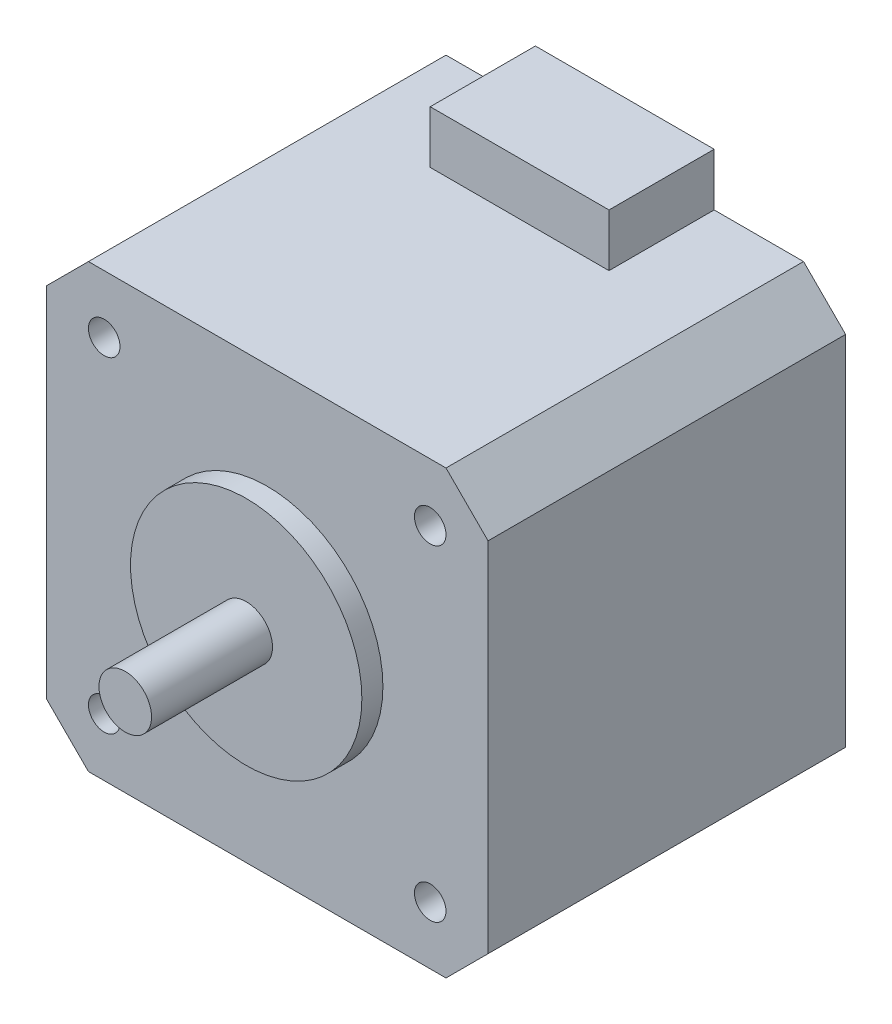
ISO-10303-21;
HEADER;
FILE_DESCRIPTION(('STEP AP214'),'2;1');
FILE_NAME('part.step','',(''),(''),'','','');
FILE_SCHEMA(('AUTOMOTIVE_DESIGN { 1 0 10303 214 1 1 1 1 }'));
ENDSEC;
DATA;
#1=APPLICATION_CONTEXT('core data for automotive mechanical design processes');
#2=APPLICATION_PROTOCOL_DEFINITION('international standard','automotive_design',2000,#1);
#3=PRODUCT_CONTEXT('',#1,'mechanical');
#4=PRODUCT('Part','Part','',(#3));
#5=PRODUCT_RELATED_PRODUCT_CATEGORY('part','',(#4));
#6=PRODUCT_DEFINITION_FORMATION('','',#4);
#7=PRODUCT_DEFINITION_CONTEXT('part definition',#1,'design');
#8=PRODUCT_DEFINITION('design','',#6,#7);
#9=PRODUCT_DEFINITION_SHAPE('','',#8);
#10=(LENGTH_UNIT() NAMED_UNIT(*) SI_UNIT(.MILLI.,.METRE.));
#11=(NAMED_UNIT(*) PLANE_ANGLE_UNIT() SI_UNIT($,.RADIAN.));
#12=(NAMED_UNIT(*) SI_UNIT($,.STERADIAN.) SOLID_ANGLE_UNIT());
#13=UNCERTAINTY_MEASURE_WITH_UNIT(LENGTH_MEASURE(1.E-05),#10,'distance_accuracy_value','');
#14=(GEOMETRIC_REPRESENTATION_CONTEXT(3) GLOBAL_UNCERTAINTY_ASSIGNED_CONTEXT((#13)) GLOBAL_UNIT_ASSIGNED_CONTEXT((#10,
#11,#12)) REPRESENTATION_CONTEXT('',''));
#15=CARTESIAN_POINT('',(0.,0.,0.));
#16=DIRECTION('',(0.,0.,1.));
#17=DIRECTION('',(1.,0.,0.));
#18=AXIS2_PLACEMENT_3D('',#15,#16,#17);
#19=CARTESIAN_POINT('',(0.,42.,34.));
#20=DIRECTION('',(0.,-1.,0.));
#21=DIRECTION('',(0.,0.,-1.));
#22=AXIS2_PLACEMENT_3D('',#19,#20,#21);
#23=PLANE('',#22);
#24=DIRECTION('',(0.,0.,1.));
#25=VECTOR('',#24,1.);
#26=CARTESIAN_POINT('',(12.5,42.,0.));
#27=LINE('',#26,#25);
#28=CARTESIAN_POINT('',(12.5,42.,0.));
#29=VERTEX_POINT('',#28);
#30=CARTESIAN_POINT('',(12.5,42.,10.));
#31=VERTEX_POINT('',#30);
#32=EDGE_CURVE('E69',#29,#31,#27,.T.);
#33=ORIENTED_EDGE('',*,*,#32,.F.);
#34=DIRECTION('',(-1.,0.,0.));
#35=VECTOR('',#34,1.);
#36=CARTESIAN_POINT('',(0.,42.,0.));
#37=LINE('',#36,#35);
#38=CARTESIAN_POINT('',(4.00000000000002,42.,0.));
#39=VERTEX_POINT('',#38);
#40=EDGE_CURVE('E212',#29,#39,#37,.T.);
#41=ORIENTED_EDGE('',*,*,#40,.T.);
#42=DIRECTION('',(0.,0.,1.));
#43=VECTOR('',#42,1.);
#44=CARTESIAN_POINT('',(4.00000000000002,42.,34.));
#45=LINE('',#44,#43);
#46=CARTESIAN_POINT('',(4.00000000000002,42.,34.));
#47=VERTEX_POINT('',#46);
#48=EDGE_CURVE('E175',#39,#47,#45,.T.);
#49=ORIENTED_EDGE('',*,*,#48,.T.);
#50=DIRECTION('',(-1.,0.,0.));
#51=VECTOR('',#50,1.);
#52=CARTESIAN_POINT('',(0.,42.,34.));
#53=LINE('',#52,#51);
#54=CARTESIAN_POINT('',(38.,42.,34.));
#55=VERTEX_POINT('',#54);
#56=EDGE_CURVE('E184',#55,#47,#53,.T.);
#57=ORIENTED_EDGE('',*,*,#56,.F.);
#58=DIRECTION('',(0.,0.,-1.));
#59=VECTOR('',#58,1.);
#60=CARTESIAN_POINT('',(38.,42.,34.));
#61=LINE('',#60,#59);
#62=CARTESIAN_POINT('',(38.,42.,0.));
#63=VERTEX_POINT('',#62);
#64=EDGE_CURVE('E217',#55,#63,#61,.T.);
#65=ORIENTED_EDGE('',*,*,#64,.T.);
#66=CARTESIAN_POINT('',(29.5,42.,0.));
#67=VERTEX_POINT('',#66);
#68=EDGE_CURVE('E190',#63,#67,#37,.T.);
#69=ORIENTED_EDGE('',*,*,#68,.T.);
#70=DIRECTION('',(0.,0.,-1.));
#71=VECTOR('',#70,1.);
#72=CARTESIAN_POINT('',(29.5,42.,0.));
#73=LINE('',#72,#71);
#74=CARTESIAN_POINT('',(29.5,42.,10.));
#75=VERTEX_POINT('',#74);
#76=EDGE_CURVE('E156',#75,#67,#73,.T.);
#77=ORIENTED_EDGE('',*,*,#76,.F.);
#78=DIRECTION('',(1.,0.,0.));
#79=VECTOR('',#78,1.);
#80=CARTESIAN_POINT('',(12.5,42.,10.));
#81=LINE('',#80,#79);
#82=EDGE_CURVE('E64',#31,#75,#81,.T.);
#83=ORIENTED_EDGE('',*,*,#82,.F.);
#84=EDGE_LOOP('',(#33,#41,#49,#57,#65,#69,#77,#83));
#85=FACE_BOUND('',#84,.T.);
#86=ADVANCED_FACE('F47',(#85),#23,.F.);
#87=CARTESIAN_POINT('',(0.,0.,34.));
#88=DIRECTION('',(1.,0.,0.));
#89=DIRECTION('',(0.,0.,-1.));
#90=AXIS2_PLACEMENT_3D('',#87,#88,#89);
#91=PLANE('',#90);
#92=DIRECTION('',(0.,-1.,0.));
#93=VECTOR('',#92,1.);
#94=CARTESIAN_POINT('',(0.,0.,0.));
#95=LINE('',#94,#93);
#96=CARTESIAN_POINT('',(0.,38.,0.));
#97=VERTEX_POINT('',#96);
#98=CARTESIAN_POINT('',(0.,4.00000000000002,0.));
#99=VERTEX_POINT('',#98);
#100=EDGE_CURVE('E180',#97,#99,#95,.T.);
#101=ORIENTED_EDGE('',*,*,#100,.T.);
#102=DIRECTION('',(0.,0.,1.));
#103=VECTOR('',#102,1.);
#104=CARTESIAN_POINT('',(0.,4.00000000000002,34.));
#105=LINE('',#104,#103);
#106=CARTESIAN_POINT('',(0.,4.00000000000002,34.));
#107=VERTEX_POINT('',#106);
#108=EDGE_CURVE('E11',#99,#107,#105,.T.);
#109=ORIENTED_EDGE('',*,*,#108,.T.);
#110=DIRECTION('',(0.,-1.,0.));
#111=VECTOR('',#110,1.);
#112=CARTESIAN_POINT('',(0.,0.,34.));
#113=LINE('',#112,#111);
#114=CARTESIAN_POINT('',(0.,38.,34.));
#115=VERTEX_POINT('',#114);
#116=EDGE_CURVE('E185',#115,#107,#113,.T.);
#117=ORIENTED_EDGE('',*,*,#116,.F.);
#118=DIRECTION('',(0.,0.,-1.));
#119=VECTOR('',#118,1.);
#120=CARTESIAN_POINT('',(0.,38.,34.));
#121=LINE('',#120,#119);
#122=EDGE_CURVE('E57',#115,#97,#121,.T.);
#123=ORIENTED_EDGE('',*,*,#122,.T.);
#124=EDGE_LOOP('',(#101,#109,#117,#123));
#125=FACE_BOUND('',#124,.T.);
#126=ADVANCED_FACE('F265',(#125),#91,.F.);
#127=CARTESIAN_POINT('',(0.,0.,34.));
#128=DIRECTION('',(0.,1.,0.));
#129=DIRECTION('',(0.,0.,1.));
#130=AXIS2_PLACEMENT_3D('',#127,#128,#129);
#131=PLANE('',#130);
#132=DIRECTION('',(1.,0.,0.));
#133=VECTOR('',#132,1.);
#134=CARTESIAN_POINT('',(0.,0.,0.));
#135=LINE('',#134,#133);
#136=CARTESIAN_POINT('',(4.,0.,0.));
#137=VERTEX_POINT('',#136);
#138=CARTESIAN_POINT('',(38.,0.,0.));
#139=VERTEX_POINT('',#138);
#140=EDGE_CURVE('E204',#137,#139,#135,.T.);
#141=ORIENTED_EDGE('',*,*,#140,.T.);
#142=DIRECTION('',(0.,0.,1.));
#143=VECTOR('',#142,1.);
#144=CARTESIAN_POINT('',(38.,0.,34.));
#145=LINE('',#144,#143);
#146=CARTESIAN_POINT('',(38.,0.,34.));
#147=VERTEX_POINT('',#146);
#148=EDGE_CURVE('E257',#139,#147,#145,.T.);
#149=ORIENTED_EDGE('',*,*,#148,.T.);
#150=DIRECTION('',(1.,0.,0.));
#151=VECTOR('',#150,1.);
#152=CARTESIAN_POINT('',(0.,0.,34.));
#153=LINE('',#152,#151);
#154=CARTESIAN_POINT('',(4.,0.,34.));
#155=VERTEX_POINT('',#154);
#156=EDGE_CURVE('E189',#155,#147,#153,.T.);
#157=ORIENTED_EDGE('',*,*,#156,.F.);
#158=DIRECTION('',(0.,0.,-1.));
#159=VECTOR('',#158,1.);
#160=CARTESIAN_POINT('',(4.,0.,34.));
#161=LINE('',#160,#159);
#162=EDGE_CURVE('E253',#155,#137,#161,.T.);
#163=ORIENTED_EDGE('',*,*,#162,.T.);
#164=EDGE_LOOP('',(#141,#149,#157,#163));
#165=FACE_BOUND('',#164,.T.);
#166=ADVANCED_FACE('F280',(#165),#131,.F.);
#167=CARTESIAN_POINT('',(42.,0.,34.));
#168=DIRECTION('',(-1.,0.,0.));
#169=DIRECTION('',(0.,-1.,0.));
#170=AXIS2_PLACEMENT_3D('',#167,#168,#169);
#171=PLANE('',#170);
#172=DIRECTION('',(0.,1.,0.));
#173=VECTOR('',#172,1.);
#174=CARTESIAN_POINT('',(42.,0.,0.));
#175=LINE('',#174,#173);
#176=CARTESIAN_POINT('',(42.,4.,0.));
#177=VERTEX_POINT('',#176);
#178=CARTESIAN_POINT('',(42.,38.,0.));
#179=VERTEX_POINT('',#178);
#180=EDGE_CURVE('E208',#177,#179,#175,.T.);
#181=ORIENTED_EDGE('',*,*,#180,.T.);
#182=DIRECTION('',(0.,0.,1.));
#183=VECTOR('',#182,1.);
#184=CARTESIAN_POINT('',(42.,38.,34.));
#185=LINE('',#184,#183);
#186=CARTESIAN_POINT('',(42.,38.,34.));
#187=VERTEX_POINT('',#186);
#188=EDGE_CURVE('E238',#179,#187,#185,.T.);
#189=ORIENTED_EDGE('',*,*,#188,.T.);
#190=DIRECTION('',(0.,1.,0.));
#191=VECTOR('',#190,1.);
#192=CARTESIAN_POINT('',(42.,0.,34.));
#193=LINE('',#192,#191);
#194=CARTESIAN_POINT('',(42.,4.,34.));
#195=VERTEX_POINT('',#194);
#196=EDGE_CURVE('E194',#195,#187,#193,.T.);
#197=ORIENTED_EDGE('',*,*,#196,.F.);
#198=DIRECTION('',(0.,0.,-1.));
#199=VECTOR('',#198,1.);
#200=CARTESIAN_POINT('',(42.,4.,34.));
#201=LINE('',#200,#199);
#202=EDGE_CURVE('E234',#195,#177,#201,.T.);
#203=ORIENTED_EDGE('',*,*,#202,.T.);
#204=EDGE_LOOP('',(#181,#189,#197,#203));
#205=FACE_BOUND('',#204,.T.);
#206=ADVANCED_FACE('F291',(#205),#171,.F.);
#207=CARTESIAN_POINT('',(0.,0.,34.));
#208=DIRECTION('',(0.,0.,-1.));
#209=DIRECTION('',(-1.,0.,0.));
#210=AXIS2_PLACEMENT_3D('',#207,#208,#209);
#211=PLANE('',#210);
#212=CARTESIAN_POINT('',(5.5,5.50000000000001,34.));
#213=DIRECTION('',(0.,0.,1.));
#214=DIRECTION('',(1.,0.,0.));
#215=AXIS2_PLACEMENT_3D('',#212,#213,#214);
#216=CIRCLE('',#215,1.5);
#217=CARTESIAN_POINT('',(7.,5.50000000000001,34.));
#218=VERTEX_POINT('',#217);
#219=EDGE_CURVE('E500',#218,#218,#216,.T.);
#220=ORIENTED_EDGE('',*,*,#219,.F.);
#221=EDGE_LOOP('',(#220));
#222=FACE_BOUND('',#221,.T.);
#223=CARTESIAN_POINT('',(36.5,5.50000000000001,34.));
#224=DIRECTION('',(0.,0.,1.));
#225=DIRECTION('',(1.,0.,0.));
#226=AXIS2_PLACEMENT_3D('',#223,#224,#225);
#227=CIRCLE('',#226,1.5);
#228=CARTESIAN_POINT('',(38.,5.50000000000001,34.));
#229=VERTEX_POINT('',#228);
#230=EDGE_CURVE('E504',#229,#229,#227,.T.);
#231=ORIENTED_EDGE('',*,*,#230,.F.);
#232=EDGE_LOOP('',(#231));
#233=FACE_BOUND('',#232,.T.);
#234=CARTESIAN_POINT('',(36.5,36.5,34.));
#235=DIRECTION('',(0.,0.,1.));
#236=DIRECTION('',(1.,0.,0.));
#237=AXIS2_PLACEMENT_3D('',#234,#235,#236);
#238=CIRCLE('',#237,1.5);
#239=CARTESIAN_POINT('',(38.,36.5,34.));
#240=VERTEX_POINT('',#239);
#241=EDGE_CURVE('E508',#240,#240,#238,.T.);
#242=ORIENTED_EDGE('',*,*,#241,.F.);
#243=EDGE_LOOP('',(#242));
#244=FACE_BOUND('',#243,.T.);
#245=CARTESIAN_POINT('',(5.5,36.5,34.));
#246=DIRECTION('',(0.,0.,1.));
#247=DIRECTION('',(1.,0.,0.));
#248=AXIS2_PLACEMENT_3D('',#245,#246,#247);
#249=CIRCLE('',#248,1.5);
#250=CARTESIAN_POINT('',(7.,36.5,34.));
#251=VERTEX_POINT('',#250);
#252=EDGE_CURVE('E512',#251,#251,#249,.T.);
#253=ORIENTED_EDGE('',*,*,#252,.F.);
#254=EDGE_LOOP('',(#253));
#255=FACE_BOUND('',#254,.T.);
#256=CARTESIAN_POINT('',(21.,21.,34.));
#257=DIRECTION('',(0.,0.,1.));
#258=DIRECTION('',(1.,0.,0.));
#259=AXIS2_PLACEMENT_3D('',#256,#257,#258);
#260=CIRCLE('',#259,11.);
#261=CARTESIAN_POINT('',(32.,21.,34.));
#262=VERTEX_POINT('',#261);
#263=EDGE_CURVE('E176',#262,#262,#260,.T.);
#264=ORIENTED_EDGE('',*,*,#263,.F.);
#265=EDGE_LOOP('',(#264));
#266=FACE_BOUND('',#265,.T.);
#267=ORIENTED_EDGE('',*,*,#196,.T.);
#268=DIRECTION('',(0.707106781186546,-0.707106781186549,0.));
#269=VECTOR('',#268,1.);
#270=CARTESIAN_POINT('',(38.,42.,34.));
#271=LINE('',#270,#269);
#272=EDGE_CURVE('E250',#187,#55,#271,.F.);
#273=ORIENTED_EDGE('',*,*,#272,.T.);
#274=ORIENTED_EDGE('',*,*,#56,.T.);
#275=DIRECTION('',(0.707106781186549,0.707106781186546,0.));
#276=VECTOR('',#275,1.);
#277=CARTESIAN_POINT('',(0.,38.,34.));
#278=LINE('',#277,#276);
#279=EDGE_CURVE('E241',#47,#115,#278,.F.);
#280=ORIENTED_EDGE('',*,*,#279,.T.);
#281=ORIENTED_EDGE('',*,*,#116,.T.);
#282=DIRECTION('',(-0.707106781186546,0.707106781186549,0.));
#283=VECTOR('',#282,1.);
#284=CARTESIAN_POINT('',(4.,0.,34.));
#285=LINE('',#284,#283);
#286=EDGE_CURVE('E244',#107,#155,#285,.F.);
#287=ORIENTED_EDGE('',*,*,#286,.T.);
#288=ORIENTED_EDGE('',*,*,#156,.T.);
#289=DIRECTION('',(-0.707106781186549,-0.707106781186546,0.));
#290=VECTOR('',#289,1.);
#291=CARTESIAN_POINT('',(42.,4.,34.));
#292=LINE('',#291,#290);
#293=EDGE_CURVE('E247',#147,#195,#292,.F.);
#294=ORIENTED_EDGE('',*,*,#293,.T.);
#295=EDGE_LOOP('',(#267,#273,#274,#280,#281,#287,#288,#294));
#296=FACE_BOUND('',#295,.T.);
#297=ADVANCED_FACE('F284',(#222,#233,#244,#255,#266,#296),#211,.F.);
#298=CARTESIAN_POINT('',(0.,0.,0.));
#299=DIRECTION('',(0.,0.,-1.));
#300=DIRECTION('',(-1.,0.,0.));
#301=AXIS2_PLACEMENT_3D('',#298,#299,#300);
#302=PLANE('',#301);
#303=ORIENTED_EDGE('',*,*,#68,.F.);
#304=DIRECTION('',(-0.707106781186546,0.707106781186549,0.));
#305=VECTOR('',#304,1.);
#306=CARTESIAN_POINT('',(40.0000000000001,39.9999999999999,0.));
#307=LINE('',#306,#305);
#308=EDGE_CURVE('E231',#63,#179,#307,.F.);
#309=ORIENTED_EDGE('',*,*,#308,.T.);
#310=ORIENTED_EDGE('',*,*,#180,.F.);
#311=DIRECTION('',(0.707106781186549,0.707106781186546,0.));
#312=VECTOR('',#311,1.);
#313=CARTESIAN_POINT('',(18.9999999999999,-19.,0.));
#314=LINE('',#313,#312);
#315=EDGE_CURVE('E228',#177,#139,#314,.F.);
#316=ORIENTED_EDGE('',*,*,#315,.T.);
#317=ORIENTED_EDGE('',*,*,#140,.F.);
#318=DIRECTION('',(0.707106781186546,-0.707106781186549,0.));
#319=VECTOR('',#318,1.);
#320=CARTESIAN_POINT('',(2.00000000000001,2.,0.));
#321=LINE('',#320,#319);
#322=EDGE_CURVE('E225',#137,#99,#321,.F.);
#323=ORIENTED_EDGE('',*,*,#322,.T.);
#324=ORIENTED_EDGE('',*,*,#100,.F.);
#325=DIRECTION('',(-0.707106781186549,-0.707106781186546,0.));
#326=VECTOR('',#325,1.);
#327=CARTESIAN_POINT('',(-19.,19.0000000000001,0.));
#328=LINE('',#327,#326);
#329=EDGE_CURVE('E221',#97,#39,#328,.F.);
#330=ORIENTED_EDGE('',*,*,#329,.T.);
#331=ORIENTED_EDGE('',*,*,#40,.F.);
#332=DIRECTION('',(0.,-1.,0.));
#333=VECTOR('',#332,1.);
#334=CARTESIAN_POINT('',(12.5,47.,0.));
#335=LINE('',#334,#333);
#336=CARTESIAN_POINT('',(12.5,47.,0.));
#337=VERTEX_POINT('',#336);
#338=EDGE_CURVE('E531',#337,#29,#335,.T.);
#339=ORIENTED_EDGE('',*,*,#338,.F.);
#340=DIRECTION('',(-1.,0.,0.));
#341=VECTOR('',#340,1.);
#342=CARTESIAN_POINT('',(12.5,47.,0.));
#343=LINE('',#342,#341);
#344=CARTESIAN_POINT('',(29.5,47.,0.));
#345=VERTEX_POINT('',#344);
#346=EDGE_CURVE('E151',#345,#337,#343,.T.);
#347=ORIENTED_EDGE('',*,*,#346,.F.);
#348=DIRECTION('',(0.,-1.,0.));
#349=VECTOR('',#348,1.);
#350=CARTESIAN_POINT('',(29.5,47.,0.));
#351=LINE('',#350,#349);
#352=EDGE_CURVE('E167',#345,#67,#351,.T.);
#353=ORIENTED_EDGE('',*,*,#352,.T.);
#354=EDGE_LOOP('',(#303,#309,#310,#316,#317,#323,#324,#330,#331,#339,#347,#353));
#355=FACE_BOUND('',#354,.T.);
#356=ADVANCED_FACE('F271',(#355),#302,.T.);
#357=CARTESIAN_POINT('',(21.,21.,36.));
#358=DIRECTION('',(0.,0.,-1.));
#359=DIRECTION('',(-1.,0.,0.));
#360=AXIS2_PLACEMENT_3D('',#357,#358,#359);
#361=CYLINDRICAL_SURFACE('',#360,11.);
#362=CARTESIAN_POINT('',(21.,21.,36.));
#363=DIRECTION('',(0.,0.,1.));
#364=DIRECTION('',(1.,0.,0.));
#365=AXIS2_PLACEMENT_3D('',#362,#363,#364);
#366=CIRCLE('',#365,11.);
#367=CARTESIAN_POINT('',(32.,21.,36.));
#368=VERTEX_POINT('',#367);
#369=EDGE_CURVE('E165',#368,#368,#366,.T.);
#370=ORIENTED_EDGE('',*,*,#369,.F.);
#371=EDGE_LOOP('',(#370));
#372=FACE_BOUND('',#371,.T.);
#373=ORIENTED_EDGE('',*,*,#263,.T.);
#374=EDGE_LOOP('',(#373));
#375=FACE_BOUND('',#374,.T.);
#376=ADVANCED_FACE('F362',(#372,#375),#361,.T.);
#377=CARTESIAN_POINT('',(21.,21.,36.));
#378=DIRECTION('',(0.,0.,1.));
#379=DIRECTION('',(1.,0.,0.));
#380=AXIS2_PLACEMENT_3D('',#377,#378,#379);
#381=PLANE('',#380);
#382=CARTESIAN_POINT('',(21.,21.,36.));
#383=DIRECTION('',(0.,0.,1.));
#384=DIRECTION('',(1.,0.,0.));
#385=AXIS2_PLACEMENT_3D('',#382,#383,#384);
#386=CIRCLE('',#385,2.5);
#387=CARTESIAN_POINT('',(23.5,21.,36.));
#388=VERTEX_POINT('',#387);
#389=EDGE_CURVE('E171',#388,#388,#386,.T.);
#390=ORIENTED_EDGE('',*,*,#389,.F.);
#391=EDGE_LOOP('',(#390));
#392=FACE_BOUND('',#391,.T.);
#393=ORIENTED_EDGE('',*,*,#369,.T.);
#394=EDGE_LOOP('',(#393));
#395=FACE_BOUND('',#394,.T.);
#396=ADVANCED_FACE('F488',(#392,#395),#381,.T.);
#397=CARTESIAN_POINT('',(21.,21.,47.5));
#398=DIRECTION('',(0.,0.,-1.));
#399=DIRECTION('',(-1.,0.,0.));
#400=AXIS2_PLACEMENT_3D('',#397,#398,#399);
#401=CYLINDRICAL_SURFACE('',#400,2.5);
#402=CARTESIAN_POINT('',(21.,21.,47.5));
#403=DIRECTION('',(0.,0.,1.));
#404=DIRECTION('',(1.,0.,0.));
#405=AXIS2_PLACEMENT_3D('',#402,#403,#404);
#406=CIRCLE('',#405,2.5);
#407=CARTESIAN_POINT('',(23.5,21.,47.5));
#408=VERTEX_POINT('',#407);
#409=EDGE_CURVE('E160',#408,#408,#406,.T.);
#410=ORIENTED_EDGE('',*,*,#409,.F.);
#411=EDGE_LOOP('',(#410));
#412=FACE_BOUND('',#411,.T.);
#413=ORIENTED_EDGE('',*,*,#389,.T.);
#414=EDGE_LOOP('',(#413));
#415=FACE_BOUND('',#414,.T.);
#416=ADVANCED_FACE('F484',(#412,#415),#401,.T.);
#417=CARTESIAN_POINT('',(21.,21.,47.5));
#418=DIRECTION('',(0.,0.,1.));
#419=DIRECTION('',(1.,0.,0.));
#420=AXIS2_PLACEMENT_3D('',#417,#418,#419);
#421=PLANE('',#420);
#422=ORIENTED_EDGE('',*,*,#409,.T.);
#423=EDGE_LOOP('',(#422));
#424=FACE_BOUND('',#423,.T.);
#425=ADVANCED_FACE('F326',(#424),#421,.T.);
#426=CARTESIAN_POINT('',(38.,42.,34.));
#427=DIRECTION('',(-0.707106781186549,-0.707106781186546,0.));
#428=DIRECTION('',(0.,0.,-1.));
#429=AXIS2_PLACEMENT_3D('',#426,#427,#428);
#430=PLANE('',#429);
#431=ORIENTED_EDGE('',*,*,#272,.F.);
#432=ORIENTED_EDGE('',*,*,#188,.F.);
#433=ORIENTED_EDGE('',*,*,#308,.F.);
#434=ORIENTED_EDGE('',*,*,#64,.F.);
#435=EDGE_LOOP('',(#431,#432,#433,#434));
#436=FACE_BOUND('',#435,.T.);
#437=ADVANCED_FACE('F297',(#436),#430,.F.);
#438=CARTESIAN_POINT('',(42.,4.,34.));
#439=DIRECTION('',(-0.707106781186546,0.707106781186549,0.));
#440=DIRECTION('',(0.,0.,-1.));
#441=AXIS2_PLACEMENT_3D('',#438,#439,#440);
#442=PLANE('',#441);
#443=ORIENTED_EDGE('',*,*,#293,.F.);
#444=ORIENTED_EDGE('',*,*,#148,.F.);
#445=ORIENTED_EDGE('',*,*,#315,.F.);
#446=ORIENTED_EDGE('',*,*,#202,.F.);
#447=EDGE_LOOP('',(#443,#444,#445,#446));
#448=FACE_BOUND('',#447,.T.);
#449=ADVANCED_FACE('F288',(#448),#442,.F.);
#450=CARTESIAN_POINT('',(4.,0.,34.));
#451=DIRECTION('',(0.707106781186549,0.707106781186546,0.));
#452=DIRECTION('',(0.,0.,-1.));
#453=AXIS2_PLACEMENT_3D('',#450,#451,#452);
#454=PLANE('',#453);
#455=ORIENTED_EDGE('',*,*,#286,.F.);
#456=ORIENTED_EDGE('',*,*,#108,.F.);
#457=ORIENTED_EDGE('',*,*,#322,.F.);
#458=ORIENTED_EDGE('',*,*,#162,.F.);
#459=EDGE_LOOP('',(#455,#456,#457,#458));
#460=FACE_BOUND('',#459,.T.);
#461=ADVANCED_FACE('F277',(#460),#454,.F.);
#462=CARTESIAN_POINT('',(0.,38.,34.));
#463=DIRECTION('',(0.707106781186546,-0.707106781186549,0.));
#464=DIRECTION('',(0.,0.,-1.));
#465=AXIS2_PLACEMENT_3D('',#462,#463,#464);
#466=PLANE('',#465);
#467=ORIENTED_EDGE('',*,*,#279,.F.);
#468=ORIENTED_EDGE('',*,*,#48,.F.);
#469=ORIENTED_EDGE('',*,*,#329,.F.);
#470=ORIENTED_EDGE('',*,*,#122,.F.);
#471=EDGE_LOOP('',(#467,#468,#469,#470));
#472=FACE_BOUND('',#471,.T.);
#473=ADVANCED_FACE('F50',(#472),#466,.F.);
#474=CARTESIAN_POINT('',(12.5,47.,0.));
#475=DIRECTION('',(1.,0.,0.));
#476=DIRECTION('',(0.,0.,-1.));
#477=AXIS2_PLACEMENT_3D('',#474,#475,#476);
#478=PLANE('',#477);
#479=ORIENTED_EDGE('',*,*,#32,.T.);
#480=DIRECTION('',(0.,-1.,0.));
#481=VECTOR('',#480,1.);
#482=CARTESIAN_POINT('',(12.5,47.,10.));
#483=LINE('',#482,#481);
#484=CARTESIAN_POINT('',(12.5,47.,10.));
#485=VERTEX_POINT('',#484);
#486=EDGE_CURVE('E139',#485,#31,#483,.T.);
#487=ORIENTED_EDGE('',*,*,#486,.F.);
#488=DIRECTION('',(0.,0.,1.));
#489=VECTOR('',#488,1.);
#490=CARTESIAN_POINT('',(12.5,47.,0.));
#491=LINE('',#490,#489);
#492=EDGE_CURVE('E146',#337,#485,#491,.T.);
#493=ORIENTED_EDGE('',*,*,#492,.F.);
#494=ORIENTED_EDGE('',*,*,#338,.T.);
#495=EDGE_LOOP('',(#479,#487,#493,#494));
#496=FACE_BOUND('',#495,.T.);
#497=ADVANCED_FACE('F158',(#496),#478,.F.);
#498=CARTESIAN_POINT('',(12.5,47.,10.));
#499=DIRECTION('',(0.,0.,-1.));
#500=DIRECTION('',(-1.,0.,0.));
#501=AXIS2_PLACEMENT_3D('',#498,#499,#500);
#502=PLANE('',#501);
#503=ORIENTED_EDGE('',*,*,#82,.T.);
#504=DIRECTION('',(0.,-1.,0.));
#505=VECTOR('',#504,1.);
#506=CARTESIAN_POINT('',(29.5,47.,10.));
#507=LINE('',#506,#505);
#508=CARTESIAN_POINT('',(29.5,47.,10.));
#509=VERTEX_POINT('',#508);
#510=EDGE_CURVE('E141',#509,#75,#507,.T.);
#511=ORIENTED_EDGE('',*,*,#510,.F.);
#512=DIRECTION('',(1.,0.,0.));
#513=VECTOR('',#512,1.);
#514=CARTESIAN_POINT('',(12.5,47.,10.));
#515=LINE('',#514,#513);
#516=EDGE_CURVE('E135',#485,#509,#515,.T.);
#517=ORIENTED_EDGE('',*,*,#516,.F.);
#518=ORIENTED_EDGE('',*,*,#486,.T.);
#519=EDGE_LOOP('',(#503,#511,#517,#518));
#520=FACE_BOUND('',#519,.T.);
#521=ADVANCED_FACE('F137',(#520),#502,.F.);
#522=CARTESIAN_POINT('',(29.5,47.,0.));
#523=DIRECTION('',(-1.,0.,0.));
#524=DIRECTION('',(0.,0.,1.));
#525=AXIS2_PLACEMENT_3D('',#522,#523,#524);
#526=PLANE('',#525);
#527=ORIENTED_EDGE('',*,*,#76,.T.);
#528=ORIENTED_EDGE('',*,*,#352,.F.);
#529=DIRECTION('',(0.,0.,-1.));
#530=VECTOR('',#529,1.);
#531=CARTESIAN_POINT('',(29.5,47.,0.));
#532=LINE('',#531,#530);
#533=EDGE_CURVE('E145',#509,#345,#532,.T.);
#534=ORIENTED_EDGE('',*,*,#533,.F.);
#535=ORIENTED_EDGE('',*,*,#510,.T.);
#536=EDGE_LOOP('',(#527,#528,#534,#535));
#537=FACE_BOUND('',#536,.T.);
#538=ADVANCED_FACE('F379',(#537),#526,.F.);
#539=CARTESIAN_POINT('',(0.,47.,0.));
#540=DIRECTION('',(0.,1.,0.));
#541=DIRECTION('',(0.,0.,1.));
#542=AXIS2_PLACEMENT_3D('',#539,#540,#541);
#543=PLANE('',#542);
#544=ORIENTED_EDGE('',*,*,#492,.T.);
#545=ORIENTED_EDGE('',*,*,#516,.T.);
#546=ORIENTED_EDGE('',*,*,#533,.T.);
#547=ORIENTED_EDGE('',*,*,#346,.T.);
#548=EDGE_LOOP('',(#544,#545,#546,#547));
#549=FACE_BOUND('',#548,.T.);
#550=ADVANCED_FACE('F149',(#549),#543,.T.);
#551=CARTESIAN_POINT('',(5.5,36.5,29.));
#552=DIRECTION('',(0.,0.,1.));
#553=DIRECTION('',(1.,0.,0.));
#554=AXIS2_PLACEMENT_3D('',#551,#552,#553);
#555=CYLINDRICAL_SURFACE('',#554,1.5);
#556=CARTESIAN_POINT('',(5.5,36.5,29.));
#557=DIRECTION('',(0.,0.,1.));
#558=DIRECTION('',(1.,0.,0.));
#559=AXIS2_PLACEMENT_3D('',#556,#557,#558);
#560=CIRCLE('',#559,1.5);
#561=CARTESIAN_POINT('',(7.,36.5,29.));
#562=VERTEX_POINT('',#561);
#563=EDGE_CURVE('E517',#562,#562,#560,.T.);
#564=ORIENTED_EDGE('',*,*,#563,.F.);
#565=EDGE_LOOP('',(#564));
#566=FACE_BOUND('',#565,.T.);
#567=ORIENTED_EDGE('',*,*,#252,.T.);
#568=EDGE_LOOP('',(#567));
#569=FACE_BOUND('',#568,.T.);
#570=ADVANCED_FACE('F397',(#566,#569),#555,.F.);
#571=CARTESIAN_POINT('',(5.5,36.5,29.));
#572=DIRECTION('',(0.,0.,1.));
#573=DIRECTION('',(1.,0.,0.));
#574=AXIS2_PLACEMENT_3D('',#571,#572,#573);
#575=PLANE('',#574);
#576=ORIENTED_EDGE('',*,*,#563,.T.);
#577=EDGE_LOOP('',(#576));
#578=FACE_BOUND('',#577,.T.);
#579=ADVANCED_FACE('F407',(#578),#575,.T.);
#580=CARTESIAN_POINT('',(36.5,36.5,29.));
#581=DIRECTION('',(0.,0.,1.));
#582=DIRECTION('',(1.,0.,0.));
#583=AXIS2_PLACEMENT_3D('',#580,#581,#582);
#584=CYLINDRICAL_SURFACE('',#583,1.5);
#585=CARTESIAN_POINT('',(36.5,36.5,29.));
#586=DIRECTION('',(0.,0.,1.));
#587=DIRECTION('',(1.,0.,0.));
#588=AXIS2_PLACEMENT_3D('',#585,#586,#587);
#589=CIRCLE('',#588,1.5);
#590=CARTESIAN_POINT('',(38.,36.5,29.));
#591=VERTEX_POINT('',#590);
#592=EDGE_CURVE('E523',#591,#591,#589,.T.);
#593=ORIENTED_EDGE('',*,*,#592,.F.);
#594=EDGE_LOOP('',(#593));
#595=FACE_BOUND('',#594,.T.);
#596=ORIENTED_EDGE('',*,*,#241,.T.);
#597=EDGE_LOOP('',(#596));
#598=FACE_BOUND('',#597,.T.);
#599=ADVANCED_FACE('F417',(#595,#598),#584,.F.);
#600=CARTESIAN_POINT('',(36.5,36.5,29.));
#601=DIRECTION('',(0.,0.,1.));
#602=DIRECTION('',(1.,0.,0.));
#603=AXIS2_PLACEMENT_3D('',#600,#601,#602);
#604=PLANE('',#603);
#605=ORIENTED_EDGE('',*,*,#592,.T.);
#606=EDGE_LOOP('',(#605));
#607=FACE_BOUND('',#606,.T.);
#608=ADVANCED_FACE('F427',(#607),#604,.T.);
#609=CARTESIAN_POINT('',(36.5,5.50000000000001,29.));
#610=DIRECTION('',(0.,0.,1.));
#611=DIRECTION('',(1.,0.,0.));
#612=AXIS2_PLACEMENT_3D('',#609,#610,#611);
#613=CYLINDRICAL_SURFACE('',#612,1.5);
#614=CARTESIAN_POINT('',(36.5,5.50000000000001,29.));
#615=DIRECTION('',(0.,0.,1.));
#616=DIRECTION('',(1.,0.,0.));
#617=AXIS2_PLACEMENT_3D('',#614,#615,#616);
#618=CIRCLE('',#617,1.5);
#619=CARTESIAN_POINT('',(38.,5.50000000000001,29.));
#620=VERTEX_POINT('',#619);
#621=EDGE_CURVE('E547',#620,#620,#618,.T.);
#622=ORIENTED_EDGE('',*,*,#621,.F.);
#623=EDGE_LOOP('',(#622));
#624=FACE_BOUND('',#623,.T.);
#625=ORIENTED_EDGE('',*,*,#230,.T.);
#626=EDGE_LOOP('',(#625));
#627=FACE_BOUND('',#626,.T.);
#628=ADVANCED_FACE('F437',(#624,#627),#613,.F.);
#629=CARTESIAN_POINT('',(36.5,5.50000000000001,29.));
#630=DIRECTION('',(0.,0.,1.));
#631=DIRECTION('',(1.,0.,0.));
#632=AXIS2_PLACEMENT_3D('',#629,#630,#631);
#633=PLANE('',#632);
#634=ORIENTED_EDGE('',*,*,#621,.T.);
#635=EDGE_LOOP('',(#634));
#636=FACE_BOUND('',#635,.T.);
#637=ADVANCED_FACE('F447',(#636),#633,.T.);
#638=CARTESIAN_POINT('',(5.5,5.50000000000001,29.));
#639=DIRECTION('',(0.,0.,1.));
#640=DIRECTION('',(1.,0.,0.));
#641=AXIS2_PLACEMENT_3D('',#638,#639,#640);
#642=CYLINDRICAL_SURFACE('',#641,1.5);
#643=CARTESIAN_POINT('',(5.5,5.50000000000001,29.));
#644=DIRECTION('',(0.,0.,1.));
#645=DIRECTION('',(1.,0.,0.));
#646=AXIS2_PLACEMENT_3D('',#643,#644,#645);
#647=CIRCLE('',#646,1.5);
#648=CARTESIAN_POINT('',(7.,5.50000000000001,29.));
#649=VERTEX_POINT('',#648);
#650=EDGE_CURVE('E542',#649,#649,#647,.T.);
#651=ORIENTED_EDGE('',*,*,#650,.F.);
#652=EDGE_LOOP('',(#651));
#653=FACE_BOUND('',#652,.T.);
#654=ORIENTED_EDGE('',*,*,#219,.T.);
#655=EDGE_LOOP('',(#654));
#656=FACE_BOUND('',#655,.T.);
#657=ADVANCED_FACE('F457',(#653,#656),#642,.F.);
#658=CARTESIAN_POINT('',(5.5,5.50000000000001,29.));
#659=DIRECTION('',(0.,0.,1.));
#660=DIRECTION('',(1.,0.,0.));
#661=AXIS2_PLACEMENT_3D('',#658,#659,#660);
#662=PLANE('',#661);
#663=ORIENTED_EDGE('',*,*,#650,.T.);
#664=EDGE_LOOP('',(#663));
#665=FACE_BOUND('',#664,.T.);
#666=ADVANCED_FACE('F467',(#665),#662,.T.);
#667=CLOSED_SHELL('',(#86,#126,#166,#206,#297,#356,#376,#396,#416,#425,#437,#449,#461,#473,#497,
#521,#538,#550,#570,#579,#599,#608,#628,#637,#657,#666));
#668=MANIFOLD_SOLID_BREP('B2',#667);
#669=ADVANCED_BREP_SHAPE_REPRESENTATION('',(#18,#668),#14);
#670=SHAPE_DEFINITION_REPRESENTATION(#9,#669);
ENDSEC;
END-ISO-10303-21;
